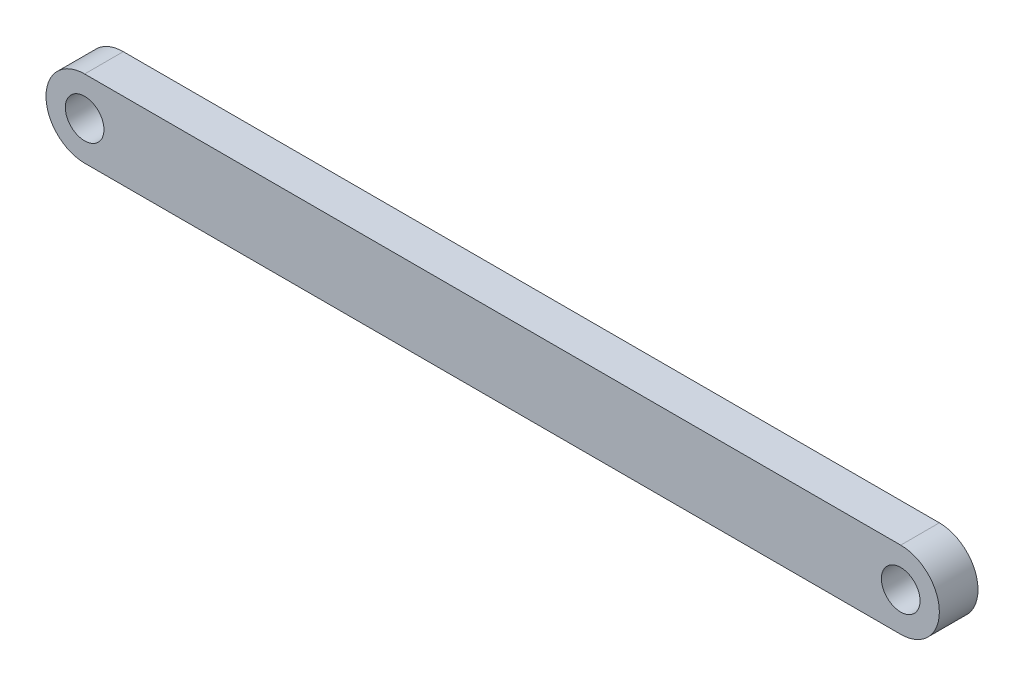
ISO-10303-21;
HEADER;
FILE_DESCRIPTION(('STEP AP214'),'2;1');
FILE_NAME('part.step','',(''),(''),'','','');
FILE_SCHEMA(('AUTOMOTIVE_DESIGN { 1 0 10303 214 1 1 1 1 }'));
ENDSEC;
DATA;
#1=APPLICATION_CONTEXT('core data for automotive mechanical design processes');
#2=APPLICATION_PROTOCOL_DEFINITION('international standard','automotive_design',2000,#1);
#3=PRODUCT_CONTEXT('',#1,'mechanical');
#4=PRODUCT('Part','Part','',(#3));
#5=PRODUCT_RELATED_PRODUCT_CATEGORY('part','',(#4));
#6=PRODUCT_DEFINITION_FORMATION('','',#4);
#7=PRODUCT_DEFINITION_CONTEXT('part definition',#1,'design');
#8=PRODUCT_DEFINITION('design','',#6,#7);
#9=PRODUCT_DEFINITION_SHAPE('','',#8);
#10=(LENGTH_UNIT() NAMED_UNIT(*) SI_UNIT(.MILLI.,.METRE.));
#11=(NAMED_UNIT(*) PLANE_ANGLE_UNIT() SI_UNIT($,.RADIAN.));
#12=(NAMED_UNIT(*) SI_UNIT($,.STERADIAN.) SOLID_ANGLE_UNIT());
#13=UNCERTAINTY_MEASURE_WITH_UNIT(LENGTH_MEASURE(1.E-05),#10,'distance_accuracy_value','');
#14=(GEOMETRIC_REPRESENTATION_CONTEXT(3) GLOBAL_UNCERTAINTY_ASSIGNED_CONTEXT((#13)) GLOBAL_UNIT_ASSIGNED_CONTEXT((#10,
#11,#12)) REPRESENTATION_CONTEXT('',''));
#15=CARTESIAN_POINT('',(0.,0.,0.));
#16=DIRECTION('',(0.,0.,1.));
#17=DIRECTION('',(1.,0.,0.));
#18=AXIS2_PLACEMENT_3D('',#15,#16,#17);
#19=CARTESIAN_POINT('',(-21.1199999718861,0.00108973957271565,2.));
#20=DIRECTION('',(0.,0.,1.));
#21=DIRECTION('',(1.,0.,0.));
#22=AXIS2_PLACEMENT_3D('',#19,#20,#21);
#23=PLANE('',#22);
#24=CARTESIAN_POINT('',(-21.1199999718861,0.00108973957271565,2.));
#25=DIRECTION('',(0.,0.,1.));
#26=DIRECTION('',(1.,0.,0.));
#27=AXIS2_PLACEMENT_3D('',#24,#25,#26);
#28=CIRCLE('',#27,1.);
#29=CARTESIAN_POINT('',(-20.1199999718861,0.00108973957271565,2.));
#30=VERTEX_POINT('',#29);
#31=EDGE_CURVE('E100',#30,#30,#28,.T.);
#32=ORIENTED_EDGE('',*,*,#31,.F.);
#33=EDGE_LOOP('',(#32));
#34=FACE_BOUND('',#33,.T.);
#35=CARTESIAN_POINT('',(-21.1199999718861,0.00108973957271565,2.));
#36=DIRECTION('',(0.,0.,1.));
#37=DIRECTION('',(1.,0.,0.));
#38=AXIS2_PLACEMENT_3D('',#35,#36,#37);
#39=CIRCLE('',#38,2.);
#40=CARTESIAN_POINT('',(-21.1199999718861,2.00108973957272,2.));
#41=VERTEX_POINT('',#40);
#42=CARTESIAN_POINT('',(-21.1199999718861,-1.99891026042728,2.));
#43=VERTEX_POINT('',#42);
#44=EDGE_CURVE('E85',#41,#43,#39,.T.);
#45=ORIENTED_EDGE('',*,*,#44,.T.);
#46=DIRECTION('',(1.,0.,0.));
#47=VECTOR('',#46,1.);
#48=CARTESIAN_POINT('',(-21.1199999718861,-1.99891026042728,2.));
#49=LINE('',#48,#47);
#50=CARTESIAN_POINT('',(21.1200000281139,-1.99891026042728,2.));
#51=VERTEX_POINT('',#50);
#52=EDGE_CURVE('E80',#43,#51,#49,.T.);
#53=ORIENTED_EDGE('',*,*,#52,.T.);
#54=CARTESIAN_POINT('',(21.1200000281139,0.00108973957271565,2.));
#55=DIRECTION('',(0.,0.,1.));
#56=DIRECTION('',(1.,0.,0.));
#57=AXIS2_PLACEMENT_3D('',#54,#55,#56);
#58=CIRCLE('',#57,2.);
#59=CARTESIAN_POINT('',(21.1200000281139,2.00108973957272,2.));
#60=VERTEX_POINT('',#59);
#61=EDGE_CURVE('E83',#51,#60,#58,.T.);
#62=ORIENTED_EDGE('',*,*,#61,.T.);
#63=DIRECTION('',(-1.,0.,0.));
#64=VECTOR('',#63,1.);
#65=CARTESIAN_POINT('',(-21.1199999718861,2.00108973957272,2.));
#66=LINE('',#65,#64);
#67=EDGE_CURVE('E50',#60,#41,#66,.T.);
#68=ORIENTED_EDGE('',*,*,#67,.T.);
#69=EDGE_LOOP('',(#45,#53,#62,#68));
#70=FACE_BOUND('',#69,.T.);
#71=CARTESIAN_POINT('',(21.1200000281139,0.00108973957271565,2.));
#72=DIRECTION('',(0.,0.,1.));
#73=DIRECTION('',(1.,0.,0.));
#74=AXIS2_PLACEMENT_3D('',#71,#72,#73);
#75=CIRCLE('',#74,1.);
#76=CARTESIAN_POINT('',(22.1200000281139,0.00108973957271565,2.));
#77=VERTEX_POINT('',#76);
#78=EDGE_CURVE('E115',#77,#77,#75,.T.);
#79=ORIENTED_EDGE('',*,*,#78,.F.);
#80=EDGE_LOOP('',(#79));
#81=FACE_BOUND('',#80,.T.);
#82=ADVANCED_FACE('F33',(#34,#70,#81),#23,.T.);
#83=CARTESIAN_POINT('',(-21.1199999718861,0.00108973957271565,0.));
#84=DIRECTION('',(0.,0.,1.));
#85=DIRECTION('',(1.,0.,0.));
#86=AXIS2_PLACEMENT_3D('',#83,#84,#85);
#87=PLANE('',#86);
#88=CARTESIAN_POINT('',(-21.1199999718861,0.00108973957271565,0.));
#89=DIRECTION('',(0.,0.,1.));
#90=DIRECTION('',(1.,0.,0.));
#91=AXIS2_PLACEMENT_3D('',#88,#89,#90);
#92=CIRCLE('',#91,2.);
#93=CARTESIAN_POINT('',(-21.1199999718861,2.00108973957272,0.));
#94=VERTEX_POINT('',#93);
#95=CARTESIAN_POINT('',(-21.1199999718861,-1.99891026042728,0.));
#96=VERTEX_POINT('',#95);
#97=EDGE_CURVE('E97',#94,#96,#92,.T.);
#98=ORIENTED_EDGE('',*,*,#97,.F.);
#99=DIRECTION('',(-1.,0.,0.));
#100=VECTOR('',#99,1.);
#101=CARTESIAN_POINT('',(-21.1199999718861,2.00108973957272,0.));
#102=LINE('',#101,#100);
#103=CARTESIAN_POINT('',(21.1200000281139,2.00108973957272,0.));
#104=VERTEX_POINT('',#103);
#105=EDGE_CURVE('E73',#104,#94,#102,.T.);
#106=ORIENTED_EDGE('',*,*,#105,.F.);
#107=CARTESIAN_POINT('',(21.1200000281139,0.00108973957271565,0.));
#108=DIRECTION('',(0.,0.,1.));
#109=DIRECTION('',(1.,0.,0.));
#110=AXIS2_PLACEMENT_3D('',#107,#108,#109);
#111=CIRCLE('',#110,2.);
#112=CARTESIAN_POINT('',(21.1200000281139,-1.99891026042728,0.));
#113=VERTEX_POINT('',#112);
#114=EDGE_CURVE('E67',#113,#104,#111,.T.);
#115=ORIENTED_EDGE('',*,*,#114,.F.);
#116=DIRECTION('',(1.,0.,0.));
#117=VECTOR('',#116,1.);
#118=CARTESIAN_POINT('',(-21.1199999718861,-1.99891026042728,0.));
#119=LINE('',#118,#117);
#120=EDGE_CURVE('E89',#96,#113,#119,.T.);
#121=ORIENTED_EDGE('',*,*,#120,.F.);
#122=EDGE_LOOP('',(#98,#106,#115,#121));
#123=FACE_BOUND('',#122,.T.);
#124=CARTESIAN_POINT('',(-21.1199999718861,0.00108973957271565,0.));
#125=DIRECTION('',(0.,0.,1.));
#126=DIRECTION('',(1.,0.,0.));
#127=AXIS2_PLACEMENT_3D('',#124,#125,#126);
#128=CIRCLE('',#127,1.);
#129=CARTESIAN_POINT('',(-20.1199999718861,0.00108973957271565,0.));
#130=VERTEX_POINT('',#129);
#131=EDGE_CURVE('E112',#130,#130,#128,.T.);
#132=ORIENTED_EDGE('',*,*,#131,.T.);
#133=EDGE_LOOP('',(#132));
#134=FACE_BOUND('',#133,.T.);
#135=CARTESIAN_POINT('',(21.1200000281139,0.00108973957271565,0.));
#136=DIRECTION('',(0.,0.,1.));
#137=DIRECTION('',(1.,0.,0.));
#138=AXIS2_PLACEMENT_3D('',#135,#136,#137);
#139=CIRCLE('',#138,1.);
#140=CARTESIAN_POINT('',(22.1200000281139,0.00108973957271565,0.));
#141=VERTEX_POINT('',#140);
#142=EDGE_CURVE('E118',#141,#141,#139,.T.);
#143=ORIENTED_EDGE('',*,*,#142,.T.);
#144=EDGE_LOOP('',(#143));
#145=FACE_BOUND('',#144,.T.);
#146=ADVANCED_FACE('F108',(#123,#134,#145),#87,.F.);
#147=CARTESIAN_POINT('',(-21.1199999718861,0.00108973957271565,2.));
#148=DIRECTION('',(0.,0.,-1.));
#149=DIRECTION('',(-1.,0.,0.));
#150=AXIS2_PLACEMENT_3D('',#147,#148,#149);
#151=CYLINDRICAL_SURFACE('',#150,2.);
#152=ORIENTED_EDGE('',*,*,#97,.T.);
#153=DIRECTION('',(0.,0.,-1.));
#154=VECTOR('',#153,1.);
#155=CARTESIAN_POINT('',(-21.1199999718861,-1.99891026042728,2.));
#156=LINE('',#155,#154);
#157=EDGE_CURVE('E11',#43,#96,#156,.T.);
#158=ORIENTED_EDGE('',*,*,#157,.F.);
#159=ORIENTED_EDGE('',*,*,#44,.F.);
#160=DIRECTION('',(0.,0.,-1.));
#161=VECTOR('',#160,1.);
#162=CARTESIAN_POINT('',(-21.1199999718861,2.00108973957272,2.));
#163=LINE('',#162,#161);
#164=EDGE_CURVE('E93',#41,#94,#163,.T.);
#165=ORIENTED_EDGE('',*,*,#164,.T.);
#166=EDGE_LOOP('',(#152,#158,#159,#165));
#167=FACE_BOUND('',#166,.T.);
#168=ADVANCED_FACE('F35',(#167),#151,.T.);
#169=CARTESIAN_POINT('',(-21.1199999718861,-1.99891026042728,2.));
#170=DIRECTION('',(0.,1.,0.));
#171=DIRECTION('',(0.,0.,1.));
#172=AXIS2_PLACEMENT_3D('',#169,#170,#171);
#173=PLANE('',#172);
#174=ORIENTED_EDGE('',*,*,#120,.T.);
#175=DIRECTION('',(0.,0.,-1.));
#176=VECTOR('',#175,1.);
#177=CARTESIAN_POINT('',(21.1200000281139,-1.99891026042728,2.));
#178=LINE('',#177,#176);
#179=EDGE_CURVE('E42',#51,#113,#178,.T.);
#180=ORIENTED_EDGE('',*,*,#179,.F.);
#181=ORIENTED_EDGE('',*,*,#52,.F.);
#182=ORIENTED_EDGE('',*,*,#157,.T.);
#183=EDGE_LOOP('',(#174,#180,#181,#182));
#184=FACE_BOUND('',#183,.T.);
#185=ADVANCED_FACE('F88',(#184),#173,.F.);
#186=CARTESIAN_POINT('',(21.1200000281139,0.00108973957271565,2.));
#187=DIRECTION('',(0.,0.,-1.));
#188=DIRECTION('',(-1.,0.,0.));
#189=AXIS2_PLACEMENT_3D('',#186,#187,#188);
#190=CYLINDRICAL_SURFACE('',#189,2.);
#191=ORIENTED_EDGE('',*,*,#114,.T.);
#192=DIRECTION('',(0.,0.,-1.));
#193=VECTOR('',#192,1.);
#194=CARTESIAN_POINT('',(21.1200000281139,2.00108973957272,2.));
#195=LINE('',#194,#193);
#196=EDGE_CURVE('E90',#60,#104,#195,.T.);
#197=ORIENTED_EDGE('',*,*,#196,.F.);
#198=ORIENTED_EDGE('',*,*,#61,.F.);
#199=ORIENTED_EDGE('',*,*,#179,.T.);
#200=EDGE_LOOP('',(#191,#197,#198,#199));
#201=FACE_BOUND('',#200,.T.);
#202=ADVANCED_FACE('F91',(#201),#190,.T.);
#203=CARTESIAN_POINT('',(-21.1199999718861,2.00108973957272,2.));
#204=DIRECTION('',(0.,-1.,0.));
#205=DIRECTION('',(0.,0.,-1.));
#206=AXIS2_PLACEMENT_3D('',#203,#204,#205);
#207=PLANE('',#206);
#208=ORIENTED_EDGE('',*,*,#105,.T.);
#209=ORIENTED_EDGE('',*,*,#164,.F.);
#210=ORIENTED_EDGE('',*,*,#67,.F.);
#211=ORIENTED_EDGE('',*,*,#196,.T.);
#212=EDGE_LOOP('',(#208,#209,#210,#211));
#213=FACE_BOUND('',#212,.T.);
#214=ADVANCED_FACE('F105',(#213),#207,.F.);
#215=CARTESIAN_POINT('',(-21.1199999718861,0.00108973957271565,2.));
#216=DIRECTION('',(0.,0.,-1.));
#217=DIRECTION('',(-1.,0.,0.));
#218=AXIS2_PLACEMENT_3D('',#215,#216,#217);
#219=CYLINDRICAL_SURFACE('',#218,1.);
#220=ORIENTED_EDGE('',*,*,#31,.T.);
#221=EDGE_LOOP('',(#220));
#222=FACE_BOUND('',#221,.T.);
#223=ORIENTED_EDGE('',*,*,#131,.F.);
#224=EDGE_LOOP('',(#223));
#225=FACE_BOUND('',#224,.T.);
#226=ADVANCED_FACE('F135',(#222,#225),#219,.F.);
#227=CARTESIAN_POINT('',(21.1200000281139,0.00108973957271565,2.));
#228=DIRECTION('',(0.,0.,-1.));
#229=DIRECTION('',(-1.,0.,0.));
#230=AXIS2_PLACEMENT_3D('',#227,#228,#229);
#231=CYLINDRICAL_SURFACE('',#230,1.);
#232=ORIENTED_EDGE('',*,*,#78,.T.);
#233=EDGE_LOOP('',(#232));
#234=FACE_BOUND('',#233,.T.);
#235=ORIENTED_EDGE('',*,*,#142,.F.);
#236=EDGE_LOOP('',(#235));
#237=FACE_BOUND('',#236,.T.);
#238=ADVANCED_FACE('F124',(#234,#237),#231,.F.);
#239=CLOSED_SHELL('',(#82,#146,#168,#185,#202,#214,#226,#238));
#240=MANIFOLD_SOLID_BREP('B2',#239);
#241=ADVANCED_BREP_SHAPE_REPRESENTATION('',(#18,#240),#14);
#242=SHAPE_DEFINITION_REPRESENTATION(#9,#241);
ENDSEC;
END-ISO-10303-21;
